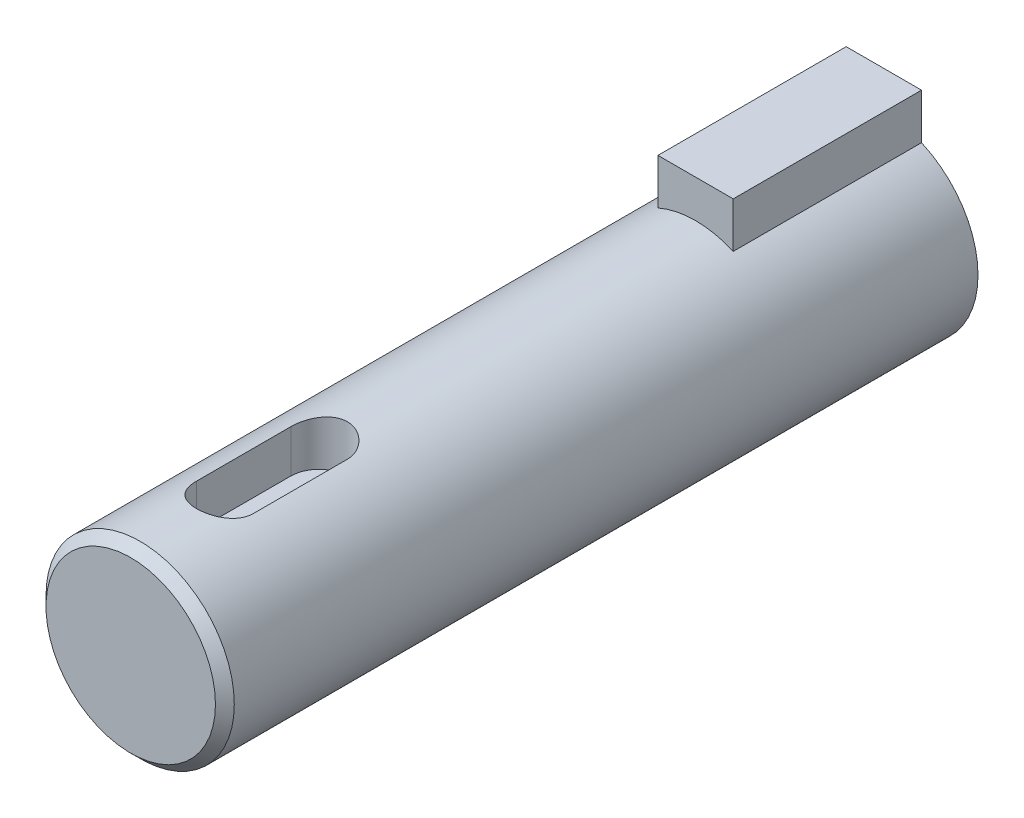
ISO-10303-21;
HEADER;
FILE_DESCRIPTION(('STEP AP214'),'2;1');
FILE_NAME('part.step','',(''),(''),'','','');
FILE_SCHEMA(('AUTOMOTIVE_DESIGN { 1 0 10303 214 1 1 1 1 }'));
ENDSEC;
DATA;
#1=APPLICATION_CONTEXT('core data for automotive mechanical design processes');
#2=APPLICATION_PROTOCOL_DEFINITION('international standard','automotive_design',2000,#1);
#3=PRODUCT_CONTEXT('',#1,'mechanical');
#4=PRODUCT('Part','Part','',(#3));
#5=PRODUCT_RELATED_PRODUCT_CATEGORY('part','',(#4));
#6=PRODUCT_DEFINITION_FORMATION('','',#4);
#7=PRODUCT_DEFINITION_CONTEXT('part definition',#1,'design');
#8=PRODUCT_DEFINITION('design','',#6,#7);
#9=PRODUCT_DEFINITION_SHAPE('','',#8);
#10=(LENGTH_UNIT() NAMED_UNIT(*) SI_UNIT(.MILLI.,.METRE.));
#11=(NAMED_UNIT(*) PLANE_ANGLE_UNIT() SI_UNIT($,.RADIAN.));
#12=(NAMED_UNIT(*) SI_UNIT($,.STERADIAN.) SOLID_ANGLE_UNIT());
#13=UNCERTAINTY_MEASURE_WITH_UNIT(LENGTH_MEASURE(1.E-05),#10,'distance_accuracy_value','');
#14=(GEOMETRIC_REPRESENTATION_CONTEXT(3) GLOBAL_UNCERTAINTY_ASSIGNED_CONTEXT((#13)) GLOBAL_UNIT_ASSIGNED_CONTEXT((#10,
#11,#12)) REPRESENTATION_CONTEXT('',''));
#15=CARTESIAN_POINT('',(0.,0.,0.));
#16=DIRECTION('',(0.,0.,1.));
#17=DIRECTION('',(1.,0.,0.));
#18=AXIS2_PLACEMENT_3D('',#15,#16,#17);
#19=CARTESIAN_POINT('',(0.,0.,10.));
#20=DIRECTION('',(0.,0.,-1.));
#21=DIRECTION('',(-1.,0.,0.));
#22=AXIS2_PLACEMENT_3D('',#19,#20,#21);
#23=CYLINDRICAL_SURFACE('',#22,5.);
#24=CARTESIAN_POINT('',(0.,0.,39.5));
#25=DIRECTION('',(0.,0.,1.));
#26=DIRECTION('',(1.,0.,0.));
#27=AXIS2_PLACEMENT_3D('',#24,#25,#26);
#28=CIRCLE('',#27,5.);
#29=CARTESIAN_POINT('',(5.,0.,39.5));
#30=VERTEX_POINT('',#29);
#31=EDGE_CURVE('E11',#30,#30,#28,.F.);
#32=ORIENTED_EDGE('',*,*,#31,.T.);
#33=EDGE_LOOP('',(#32));
#34=FACE_BOUND('',#33,.T.);
#35=CARTESIAN_POINT('',(0.,0.,0.));
#36=DIRECTION('',(0.,0.,1.));
#37=DIRECTION('',(1.,0.,0.));
#38=AXIS2_PLACEMENT_3D('',#35,#36,#37);
#39=CIRCLE('',#38,5.);
#40=CARTESIAN_POINT('',(-2.,4.58257569495584,0.));
#41=VERTEX_POINT('',#40);
#42=CARTESIAN_POINT('',(2.,4.58257569495584,0.));
#43=VERTEX_POINT('',#42);
#44=EDGE_CURVE('E158',#41,#43,#39,.T.);
#45=ORIENTED_EDGE('',*,*,#44,.T.);
#46=DIRECTION('',(0.,0.,-1.));
#47=VECTOR('',#46,1.);
#48=CARTESIAN_POINT('',(2.,4.58257569495584,10.));
#49=LINE('',#48,#47);
#50=CARTESIAN_POINT('',(2.,4.58257569495584,10.));
#51=VERTEX_POINT('',#50);
#52=EDGE_CURVE('E187',#51,#43,#49,.T.);
#53=ORIENTED_EDGE('',*,*,#52,.F.);
#54=CARTESIAN_POINT('',(0.,0.,10.));
#55=DIRECTION('',(0.,0.,1.));
#56=DIRECTION('',(1.,0.,0.));
#57=AXIS2_PLACEMENT_3D('',#54,#55,#56);
#58=CIRCLE('',#57,5.);
#59=CARTESIAN_POINT('',(-2.,4.58257569495584,10.));
#60=VERTEX_POINT('',#59);
#61=EDGE_CURVE('E125',#51,#60,#58,.T.);
#62=ORIENTED_EDGE('',*,*,#61,.T.);
#63=DIRECTION('',(0.,0.,-1.));
#64=VECTOR('',#63,1.);
#65=CARTESIAN_POINT('',(-2.,4.58257569495584,10.));
#66=LINE('',#65,#64);
#67=EDGE_CURVE('E166',#60,#41,#66,.T.);
#68=ORIENTED_EDGE('',*,*,#67,.T.);
#69=EDGE_LOOP('',(#45,#53,#62,#68));
#70=FACE_BOUND('',#69,.T.);
#71=CARTESIAN_POINT('',(1.5,4.76969600708473,30.));
#72=CARTESIAN_POINT('',(1.50000085357071,4.76969249084934,29.958820607092));
#73=CARTESIAN_POINT('',(1.49830317083428,4.77022997000129,29.9176619568739));
#74=CARTESIAN_POINT('',(1.49153785660317,4.77235095109999,29.8356588379044));
#75=CARTESIAN_POINT('',(1.48647098275841,4.77393421787376,29.7948143006051));
#76=CARTESIAN_POINT('',(1.46630203689311,4.78018490618873,29.6734094590453));
#77=CARTESIAN_POINT('',(1.44623120413662,4.78635370384275,29.5936936095836));
#78=CARTESIAN_POINT('',(1.39353102315626,4.80195952113208,29.4389644216141));
#79=CARTESIAN_POINT('',(1.36090607068203,4.81139539670393,29.3639494478019));
#80=CARTESIAN_POINT('',(1.28407841117655,4.83246571212052,29.2204033184024));
#81=CARTESIAN_POINT('',(1.23987031651226,4.84410117434933,29.1518752002716));
#82=CARTESIAN_POINT('',(1.13964850658326,4.86866835244721,29.021133944003));
#83=CARTESIAN_POINT('',(1.08333433465208,4.88162755412974,28.9591563396566));
#84=CARTESIAN_POINT('',(0.961138919873356,4.90714811559049,28.8453644161));
#85=CARTESIAN_POINT('',(0.895256063916349,4.91970940785249,28.7935518139969));
#86=CARTESIAN_POINT('',(0.75410992131543,4.94333239727705,28.7005362296815));
#87=CARTESIAN_POINT('',(0.67868081933626,4.95435770971354,28.6595748197021));
#88=CARTESIAN_POINT('',(0.521621185505775,4.97334469846208,28.5910115883818));
#89=CARTESIAN_POINT('',(0.439992259012928,4.98130716463903,28.5634063222057));
#90=CARTESIAN_POINT('',(0.275324697874879,4.99307639935002,28.523120200898));
#91=CARTESIAN_POINT('',(0.192393125294254,4.99699549276993,28.5100351420303));
#92=CARTESIAN_POINT('',(0.0254235719980829,5.00063202022426,28.4978826586367));
#93=CARTESIAN_POINT('',(-0.0586141962423613,5.00035024971471,28.4988125802998));
#94=CARTESIAN_POINT('',(-0.222571599946016,4.99569602566267,28.514392908759));
#95=CARTESIAN_POINT('',(-0.30253714546464,4.99145415509187,28.5286053449787));
#96=CARTESIAN_POINT('',(-0.458890052102025,4.9795151369998,28.5696316352381));
#97=CARTESIAN_POINT('',(-0.535277225531997,4.97181780846028,28.5964461494559));
#98=CARTESIAN_POINT('',(-0.683347815892216,4.95365214926145,28.6622122216464));
#99=CARTESIAN_POINT('',(-0.754966006044142,4.94315255692525,28.7013016443569));
#100=CARTESIAN_POINT('',(-0.89076552957442,4.92049624651755,28.7903985900483));
#101=CARTESIAN_POINT('',(-0.954945191614595,4.90833915735884,28.8404085594788));
#102=CARTESIAN_POINT('',(-1.07665450541275,4.88311673571409,28.9521919880835));
#103=CARTESIAN_POINT('',(-1.13383351478034,4.87003445449554,29.0143438637607));
#104=CARTESIAN_POINT('',(-1.23706769492487,4.84484215114658,29.1474974234279));
#105=CARTESIAN_POINT('',(-1.28311962013077,4.83273241337565,29.2185016803655));
#106=CARTESIAN_POINT('',(-1.36316407240863,4.81077228795653,29.3682809284493));
#107=CARTESIAN_POINT('',(-1.39703006341134,4.80094596245948,29.4471271795934));
#108=CARTESIAN_POINT('',(-1.45085886004699,4.78495663653201,29.6097245039817));
#109=CARTESIAN_POINT('',(-1.47084293218035,4.77878803475875,29.6934678607144));
#110=CARTESIAN_POINT('',(-1.48901203590079,4.77314032325006,29.8149948890702));
#111=CARTESIAN_POINT('',(-1.49313202989009,4.77185156275267,29.8518907341796));
#112=CARTESIAN_POINT('',(-1.49862355614854,4.77012928611782,29.9258514790995));
#113=CARTESIAN_POINT('',(-1.49999912968269,4.76969451246644,29.9629160496639));
#114=CARTESIAN_POINT('',(-1.5,4.76969600708473,30.));
#115=B_SPLINE_CURVE_WITH_KNOTS('',3,(#71,#72,#73,#74,#75,#76,#77,#78,#79,#80,#81,#82,#83,#84,
#85,#86,#87,#88,#89,#90,#91,#92,#93,#94,#95,#96,#97,#98,#99,#100,#101,#102,#103,#104,#105,#106,
#107,#108,#109,#110,#111,#112,#113,#114),.UNSPECIFIED.,.F.,.F.,(4,2,2,2,2,2,2,2,2,2,2,2,2,2,2,2,
2,2,2,2,2,4),(0.,0.123459071219737,0.246890388853047,0.492911349615212,0.73884624588433,
0.984895736828095,1.23795510798803,1.49105719006936,1.74939356197455,2.00766326783256,
2.25854751319802,2.5093842528947,2.75223130012966,2.99509107067836,3.2407824256273,
3.48652887757005,3.74172568310981,3.99699683536777,4.25484698071527,4.51230123440207,
4.62365084745809,4.73483637253616),.UNSPECIFIED.);
#116=CARTESIAN_POINT('',(1.5,4.76969600708473,30.));
#117=VERTEX_POINT('',#116);
#118=CARTESIAN_POINT('',(-1.5,4.76969600708473,30.));
#119=VERTEX_POINT('',#118);
#120=EDGE_CURVE('E121',#117,#119,#115,.T.);
#121=ORIENTED_EDGE('',*,*,#120,.F.);
#122=DIRECTION('',(0.,0.,-1.));
#123=VECTOR('',#122,1.);
#124=CARTESIAN_POINT('',(1.5,4.76969600708473,10.));
#125=LINE('',#124,#123);
#126=CARTESIAN_POINT('',(1.5,4.76969600708473,35.));
#127=VERTEX_POINT('',#126);
#128=EDGE_CURVE('E191',#127,#117,#125,.T.);
#129=ORIENTED_EDGE('',*,*,#128,.F.);
#130=CARTESIAN_POINT('',(-1.5,4.76969600708473,35.));
#131=CARTESIAN_POINT('',(-1.50000085357071,4.76969249084934,35.041179392908));
#132=CARTESIAN_POINT('',(-1.49830317083428,4.77022997000129,35.0823380431261));
#133=CARTESIAN_POINT('',(-1.49153785660316,4.77235095109999,35.1643411620956));
#134=CARTESIAN_POINT('',(-1.48647098275841,4.77393421787376,35.2051856993949));
#135=CARTESIAN_POINT('',(-1.46630203689311,4.78018490618873,35.3265905409547));
#136=CARTESIAN_POINT('',(-1.44623120413662,4.78635370384275,35.4063063904164));
#137=CARTESIAN_POINT('',(-1.39353102315626,4.80195952113208,35.5610355783859));
#138=CARTESIAN_POINT('',(-1.36090607068203,4.81139539670393,35.6360505521981));
#139=CARTESIAN_POINT('',(-1.28407841117656,4.83246571212052,35.7795966815976));
#140=CARTESIAN_POINT('',(-1.23987031651226,4.84410117434933,35.8481247997284));
#141=CARTESIAN_POINT('',(-1.13964850658326,4.86866835244721,35.9788660559971));
#142=CARTESIAN_POINT('',(-1.08333433465208,4.88162755412974,36.0408436603434));
#143=CARTESIAN_POINT('',(-0.961138919873353,4.90714811559049,36.1546355839));
#144=CARTESIAN_POINT('',(-0.895256063916347,4.91970940785249,36.2064481860031));
#145=CARTESIAN_POINT('',(-0.754109921315428,4.94333239727705,36.2994637703185));
#146=CARTESIAN_POINT('',(-0.678680819336257,4.95435770971354,36.340425180298));
#147=CARTESIAN_POINT('',(-0.521621185505771,4.97334469846208,36.4089884116182));
#148=CARTESIAN_POINT('',(-0.439992259012924,4.98130716463903,36.4365936777943));
#149=CARTESIAN_POINT('',(-0.275324697874875,4.99307639935002,36.4768797991021));
#150=CARTESIAN_POINT('',(-0.192393125294251,4.99699549276993,36.4899648579698));
#151=CARTESIAN_POINT('',(-0.0254235719980798,5.00063202022426,36.5021173413633));
#152=CARTESIAN_POINT('',(0.0586141962423641,5.00035024971471,36.5011874197002));
#153=CARTESIAN_POINT('',(0.222571599946019,4.99569602566267,36.485607091241));
#154=CARTESIAN_POINT('',(0.302537145464643,4.99145415509187,36.4713946550213));
#155=CARTESIAN_POINT('',(0.458890052102028,4.9795151369998,36.4303683647619));
#156=CARTESIAN_POINT('',(0.535277225531999,4.97181780846028,36.4035538505441));
#157=CARTESIAN_POINT('',(0.683347815892218,4.95365214926145,36.3377877783536));
#158=CARTESIAN_POINT('',(0.754966006044145,4.94315255692525,36.2986983556431));
#159=CARTESIAN_POINT('',(0.890765529574423,4.92049624651755,36.2096014099517));
#160=CARTESIAN_POINT('',(0.954945191614596,4.90833915735884,36.1595914405212));
#161=CARTESIAN_POINT('',(1.07665450541275,4.88311673571409,36.0478080119165));
#162=CARTESIAN_POINT('',(1.13383351478034,4.87003445449554,35.9856561362393));
#163=CARTESIAN_POINT('',(1.23706769492487,4.84484215114658,35.8525025765721));
#164=CARTESIAN_POINT('',(1.28311962013078,4.83273241337565,35.7814983196345));
#165=CARTESIAN_POINT('',(1.36316407240863,4.81077228795653,35.6317190715507));
#166=CARTESIAN_POINT('',(1.39703006341135,4.80094596245948,35.5528728204066));
#167=CARTESIAN_POINT('',(1.45085886004699,4.78495663653201,35.3902754960183));
#168=CARTESIAN_POINT('',(1.47084293218036,4.77878803475875,35.3065321392856));
#169=CARTESIAN_POINT('',(1.4890120359008,4.77314032325006,35.1850051109298));
#170=CARTESIAN_POINT('',(1.49313202989009,4.77185156275267,35.1481092658204));
#171=CARTESIAN_POINT('',(1.49862355614854,4.77012928611782,35.0741485209005));
#172=CARTESIAN_POINT('',(1.49999912968269,4.76969451246644,35.0370839503361));
#173=CARTESIAN_POINT('',(1.5,4.76969600708473,35.));
#174=B_SPLINE_CURVE_WITH_KNOTS('',3,(#130,#131,#132,#133,#134,#135,#136,#137,#138,#139,#140,
#141,#142,#143,#144,#145,#146,#147,#148,#149,#150,#151,#152,#153,#154,#155,#156,#157,#158,#159,
#160,#161,#162,#163,#164,#165,#166,#167,#168,#169,#170,#171,#172,#173),.UNSPECIFIED.,.F.,.F.,(4,
2,2,2,2,2,2,2,2,2,2,2,2,2,2,2,2,2,2,2,2,4),(0.,0.123459071219744,0.246890388853047,
0.492911349615212,0.738846245884322,0.984895736828089,1.23795510798803,1.49105719006936,
1.74939356197456,2.00766326783256,2.25854751319802,2.5093842528947,2.75223130012966,
2.99509107067836,3.24078242562731,3.48652887757005,3.74172568310981,3.99699683536778,
4.25484698071527,4.51230123440207,4.62365084745809,4.73483637253615),.UNSPECIFIED.);
#175=CARTESIAN_POINT('',(-1.5,4.76969600708473,35.));
#176=VERTEX_POINT('',#175);
#177=EDGE_CURVE('E194',#176,#127,#174,.T.);
#178=ORIENTED_EDGE('',*,*,#177,.F.);
#179=DIRECTION('',(0.,0.,-1.));
#180=VECTOR('',#179,1.);
#181=CARTESIAN_POINT('',(-1.5,4.76969600708473,10.));
#182=LINE('',#181,#180);
#183=EDGE_CURVE('E202',#119,#176,#182,.F.);
#184=ORIENTED_EDGE('',*,*,#183,.F.);
#185=EDGE_LOOP('',(#121,#129,#178,#184));
#186=FACE_BOUND('',#185,.T.);
#187=ADVANCED_FACE('F39',(#34,#70,#186),#23,.T.);
#188=CARTESIAN_POINT('',(2.,7.,10.));
#189=DIRECTION('',(-1.,0.,0.));
#190=DIRECTION('',(0.,-1.,0.));
#191=AXIS2_PLACEMENT_3D('',#188,#189,#190);
#192=PLANE('',#191);
#193=DIRECTION('',(0.,1.,0.));
#194=VECTOR('',#193,1.);
#195=CARTESIAN_POINT('',(2.,7.,0.));
#196=LINE('',#195,#194);
#197=CARTESIAN_POINT('',(2.,7.,0.));
#198=VERTEX_POINT('',#197);
#199=EDGE_CURVE('E170',#43,#198,#196,.T.);
#200=ORIENTED_EDGE('',*,*,#199,.T.);
#201=DIRECTION('',(0.,0.,-1.));
#202=VECTOR('',#201,1.);
#203=CARTESIAN_POINT('',(2.,7.,10.));
#204=LINE('',#203,#202);
#205=CARTESIAN_POINT('',(2.,7.,10.));
#206=VERTEX_POINT('',#205);
#207=EDGE_CURVE('E183',#206,#198,#204,.T.);
#208=ORIENTED_EDGE('',*,*,#207,.F.);
#209=DIRECTION('',(0.,1.,0.));
#210=VECTOR('',#209,1.);
#211=CARTESIAN_POINT('',(2.,7.,10.));
#212=LINE('',#211,#210);
#213=EDGE_CURVE('E88',#51,#206,#212,.T.);
#214=ORIENTED_EDGE('',*,*,#213,.F.);
#215=ORIENTED_EDGE('',*,*,#52,.T.);
#216=EDGE_LOOP('',(#200,#208,#214,#215));
#217=FACE_BOUND('',#216,.T.);
#218=ADVANCED_FACE('F238',(#217),#192,.F.);
#219=CARTESIAN_POINT('',(-2.,7.,10.));
#220=DIRECTION('',(0.,-1.,0.));
#221=DIRECTION('',(0.,0.,-1.));
#222=AXIS2_PLACEMENT_3D('',#219,#220,#221);
#223=PLANE('',#222);
#224=DIRECTION('',(-1.,0.,0.));
#225=VECTOR('',#224,1.);
#226=CARTESIAN_POINT('',(-2.,7.,0.));
#227=LINE('',#226,#225);
#228=CARTESIAN_POINT('',(-2.,7.,0.));
#229=VERTEX_POINT('',#228);
#230=EDGE_CURVE('E173',#198,#229,#227,.T.);
#231=ORIENTED_EDGE('',*,*,#230,.T.);
#232=DIRECTION('',(0.,0.,-1.));
#233=VECTOR('',#232,1.);
#234=CARTESIAN_POINT('',(-2.,7.,10.));
#235=LINE('',#234,#233);
#236=CARTESIAN_POINT('',(-2.,7.,10.));
#237=VERTEX_POINT('',#236);
#238=EDGE_CURVE('E180',#237,#229,#235,.T.);
#239=ORIENTED_EDGE('',*,*,#238,.F.);
#240=DIRECTION('',(-1.,0.,0.));
#241=VECTOR('',#240,1.);
#242=CARTESIAN_POINT('',(-2.,7.,10.));
#243=LINE('',#242,#241);
#244=EDGE_CURVE('E161',#206,#237,#243,.T.);
#245=ORIENTED_EDGE('',*,*,#244,.F.);
#246=ORIENTED_EDGE('',*,*,#207,.T.);
#247=EDGE_LOOP('',(#231,#239,#245,#246));
#248=FACE_BOUND('',#247,.T.);
#249=ADVANCED_FACE('F243',(#248),#223,.F.);
#250=CARTESIAN_POINT('',(-2.,7.,10.));
#251=DIRECTION('',(1.,0.,0.));
#252=DIRECTION('',(0.,1.,0.));
#253=AXIS2_PLACEMENT_3D('',#250,#251,#252);
#254=PLANE('',#253);
#255=DIRECTION('',(0.,-1.,0.));
#256=VECTOR('',#255,1.);
#257=CARTESIAN_POINT('',(-2.,7.,0.));
#258=LINE('',#257,#256);
#259=EDGE_CURVE('E84',#229,#41,#258,.T.);
#260=ORIENTED_EDGE('',*,*,#259,.T.);
#261=ORIENTED_EDGE('',*,*,#67,.F.);
#262=DIRECTION('',(0.,-1.,0.));
#263=VECTOR('',#262,1.);
#264=CARTESIAN_POINT('',(-2.,7.,10.));
#265=LINE('',#264,#263);
#266=EDGE_CURVE('E64',#237,#60,#265,.T.);
#267=ORIENTED_EDGE('',*,*,#266,.F.);
#268=ORIENTED_EDGE('',*,*,#238,.T.);
#269=EDGE_LOOP('',(#260,#261,#267,#268));
#270=FACE_BOUND('',#269,.T.);
#271=ADVANCED_FACE('F309',(#270),#254,.F.);
#272=CARTESIAN_POINT('',(0.,0.,10.));
#273=DIRECTION('',(0.,0.,1.));
#274=DIRECTION('',(1.,0.,0.));
#275=AXIS2_PLACEMENT_3D('',#272,#273,#274);
#276=PLANE('',#275);
#277=ORIENTED_EDGE('',*,*,#61,.F.);
#278=ORIENTED_EDGE('',*,*,#213,.T.);
#279=ORIENTED_EDGE('',*,*,#244,.T.);
#280=ORIENTED_EDGE('',*,*,#266,.T.);
#281=EDGE_LOOP('',(#277,#278,#279,#280));
#282=FACE_BOUND('',#281,.T.);
#283=ADVANCED_FACE('F305',(#282),#276,.T.);
#284=CARTESIAN_POINT('',(0.,0.,0.));
#285=DIRECTION('',(0.,0.,1.));
#286=DIRECTION('',(1.,0.,0.));
#287=AXIS2_PLACEMENT_3D('',#284,#285,#286);
#288=PLANE('',#287);
#289=ORIENTED_EDGE('',*,*,#44,.F.);
#290=ORIENTED_EDGE('',*,*,#259,.F.);
#291=ORIENTED_EDGE('',*,*,#230,.F.);
#292=ORIENTED_EDGE('',*,*,#199,.F.);
#293=EDGE_LOOP('',(#289,#290,#291,#292));
#294=FACE_BOUND('',#293,.T.);
#295=ADVANCED_FACE('F275',(#294),#288,.F.);
#296=CARTESIAN_POINT('',(0.,0.,40.));
#297=DIRECTION('',(0.,0.,1.));
#298=DIRECTION('',(1.,0.,0.));
#299=AXIS2_PLACEMENT_3D('',#296,#297,#298);
#300=PLANE('',#299);
#301=CARTESIAN_POINT('',(0.,0.,40.));
#302=DIRECTION('',(0.,0.,1.));
#303=DIRECTION('',(1.,0.,0.));
#304=AXIS2_PLACEMENT_3D('',#301,#302,#303);
#305=CIRCLE('',#304,4.5);
#306=CARTESIAN_POINT('',(4.5,0.,40.));
#307=VERTEX_POINT('',#306);
#308=EDGE_CURVE('E48',#307,#307,#305,.T.);
#309=ORIENTED_EDGE('',*,*,#308,.T.);
#310=EDGE_LOOP('',(#309));
#311=FACE_BOUND('',#310,.T.);
#312=ADVANCED_FACE('F219',(#311),#300,.T.);
#313=CARTESIAN_POINT('',(0.,7.,30.));
#314=DIRECTION('',(0.,-1.,0.));
#315=DIRECTION('',(0.,0.,-1.));
#316=AXIS2_PLACEMENT_3D('',#313,#314,#315);
#317=CYLINDRICAL_SURFACE('',#316,1.5);
#318=ORIENTED_EDGE('',*,*,#120,.T.);
#319=DIRECTION('',(0.,-1.,0.));
#320=VECTOR('',#319,1.);
#321=CARTESIAN_POINT('',(-1.5,7.,30.));
#322=LINE('',#321,#320);
#323=CARTESIAN_POINT('',(-1.5,2.5,30.));
#324=VERTEX_POINT('',#323);
#325=EDGE_CURVE('E114',#119,#324,#322,.T.);
#326=ORIENTED_EDGE('',*,*,#325,.T.);
#327=CARTESIAN_POINT('',(0.,2.5,30.));
#328=DIRECTION('',(0.,1.,0.));
#329=DIRECTION('',(0.,0.,1.));
#330=AXIS2_PLACEMENT_3D('',#327,#328,#329);
#331=CIRCLE('',#330,1.5);
#332=CARTESIAN_POINT('',(1.5,2.5,30.));
#333=VERTEX_POINT('',#332);
#334=EDGE_CURVE('E119',#333,#324,#331,.T.);
#335=ORIENTED_EDGE('',*,*,#334,.F.);
#336=DIRECTION('',(0.,-1.,0.));
#337=VECTOR('',#336,1.);
#338=CARTESIAN_POINT('',(1.5,7.,30.));
#339=LINE('',#338,#337);
#340=EDGE_CURVE('E148',#117,#333,#339,.T.);
#341=ORIENTED_EDGE('',*,*,#340,.F.);
#342=EDGE_LOOP('',(#318,#326,#335,#341));
#343=FACE_BOUND('',#342,.T.);
#344=ADVANCED_FACE('F116',(#343),#317,.F.);
#345=CARTESIAN_POINT('',(-1.5,7.,30.));
#346=DIRECTION('',(1.,0.,0.));
#347=DIRECTION('',(0.,0.,-1.));
#348=AXIS2_PLACEMENT_3D('',#345,#346,#347);
#349=PLANE('',#348);
#350=ORIENTED_EDGE('',*,*,#183,.T.);
#351=DIRECTION('',(0.,-1.,0.));
#352=VECTOR('',#351,1.);
#353=CARTESIAN_POINT('',(-1.5,7.,35.));
#354=LINE('',#353,#352);
#355=CARTESIAN_POINT('',(-1.5,2.5,35.));
#356=VERTEX_POINT('',#355);
#357=EDGE_CURVE('E126',#176,#356,#354,.T.);
#358=ORIENTED_EDGE('',*,*,#357,.T.);
#359=DIRECTION('',(0.,0.,1.));
#360=VECTOR('',#359,1.);
#361=CARTESIAN_POINT('',(-1.5,2.5,30.));
#362=LINE('',#361,#360);
#363=EDGE_CURVE('E129',#324,#356,#362,.T.);
#364=ORIENTED_EDGE('',*,*,#363,.F.);
#365=ORIENTED_EDGE('',*,*,#325,.F.);
#366=EDGE_LOOP('',(#350,#358,#364,#365));
#367=FACE_BOUND('',#366,.T.);
#368=ADVANCED_FACE('F130',(#367),#349,.T.);
#369=CARTESIAN_POINT('',(0.,7.,35.));
#370=DIRECTION('',(0.,-1.,0.));
#371=DIRECTION('',(0.,0.,-1.));
#372=AXIS2_PLACEMENT_3D('',#369,#370,#371);
#373=CYLINDRICAL_SURFACE('',#372,1.5);
#374=ORIENTED_EDGE('',*,*,#177,.T.);
#375=DIRECTION('',(0.,-1.,0.));
#376=VECTOR('',#375,1.);
#377=CARTESIAN_POINT('',(1.5,7.,35.));
#378=LINE('',#377,#376);
#379=CARTESIAN_POINT('',(1.5,2.5,35.));
#380=VERTEX_POINT('',#379);
#381=EDGE_CURVE('E55',#127,#380,#378,.T.);
#382=ORIENTED_EDGE('',*,*,#381,.T.);
#383=CARTESIAN_POINT('',(0.,2.5,35.));
#384=DIRECTION('',(0.,1.,0.));
#385=DIRECTION('',(0.,0.,1.));
#386=AXIS2_PLACEMENT_3D('',#383,#384,#385);
#387=CIRCLE('',#386,1.5);
#388=EDGE_CURVE('E136',#356,#380,#387,.T.);
#389=ORIENTED_EDGE('',*,*,#388,.F.);
#390=ORIENTED_EDGE('',*,*,#357,.F.);
#391=EDGE_LOOP('',(#374,#382,#389,#390));
#392=FACE_BOUND('',#391,.T.);
#393=ADVANCED_FACE('F206',(#392),#373,.F.);
#394=CARTESIAN_POINT('',(1.5,7.,30.));
#395=DIRECTION('',(-1.,0.,0.));
#396=DIRECTION('',(0.,0.,1.));
#397=AXIS2_PLACEMENT_3D('',#394,#395,#396);
#398=PLANE('',#397);
#399=ORIENTED_EDGE('',*,*,#128,.T.);
#400=ORIENTED_EDGE('',*,*,#340,.T.);
#401=DIRECTION('',(0.,0.,-1.));
#402=VECTOR('',#401,1.);
#403=CARTESIAN_POINT('',(1.5,2.5,30.));
#404=LINE('',#403,#402);
#405=EDGE_CURVE('E140',#380,#333,#404,.T.);
#406=ORIENTED_EDGE('',*,*,#405,.F.);
#407=ORIENTED_EDGE('',*,*,#381,.F.);
#408=EDGE_LOOP('',(#399,#400,#406,#407));
#409=FACE_BOUND('',#408,.T.);
#410=ADVANCED_FACE('F211',(#409),#398,.T.);
#411=CARTESIAN_POINT('',(0.,2.5,30.));
#412=DIRECTION('',(0.,1.,0.));
#413=DIRECTION('',(0.,0.,1.));
#414=AXIS2_PLACEMENT_3D('',#411,#412,#413);
#415=PLANE('',#414);
#416=ORIENTED_EDGE('',*,*,#334,.T.);
#417=ORIENTED_EDGE('',*,*,#363,.T.);
#418=ORIENTED_EDGE('',*,*,#388,.T.);
#419=ORIENTED_EDGE('',*,*,#405,.T.);
#420=EDGE_LOOP('',(#416,#417,#418,#419));
#421=FACE_BOUND('',#420,.T.);
#422=ADVANCED_FACE('F139',(#421),#415,.T.);
#423=CARTESIAN_POINT('',(0.,0.,40.));
#424=DIRECTION('',(0.,0.,-1.));
#425=DIRECTION('',(-1.,0.,0.));
#426=AXIS2_PLACEMENT_3D('',#423,#424,#425);
#427=CONICAL_SURFACE('',#426,4.5,0.785398163397457);
#428=ORIENTED_EDGE('',*,*,#31,.F.);
#429=EDGE_LOOP('',(#428));
#430=FACE_BOUND('',#429,.T.);
#431=ORIENTED_EDGE('',*,*,#308,.F.);
#432=EDGE_LOOP('',(#431));
#433=FACE_BOUND('',#432,.T.);
#434=ADVANCED_FACE('F41',(#430,#433),#427,.T.);
#435=CLOSED_SHELL('',(#187,#218,#249,#271,#283,#295,#312,#344,#368,#393,#410,#422,#434));
#436=MANIFOLD_SOLID_BREP('B2',#435);
#437=ADVANCED_BREP_SHAPE_REPRESENTATION('',(#18,#436),#14);
#438=SHAPE_DEFINITION_REPRESENTATION(#9,#437);
ENDSEC;
END-ISO-10303-21;
